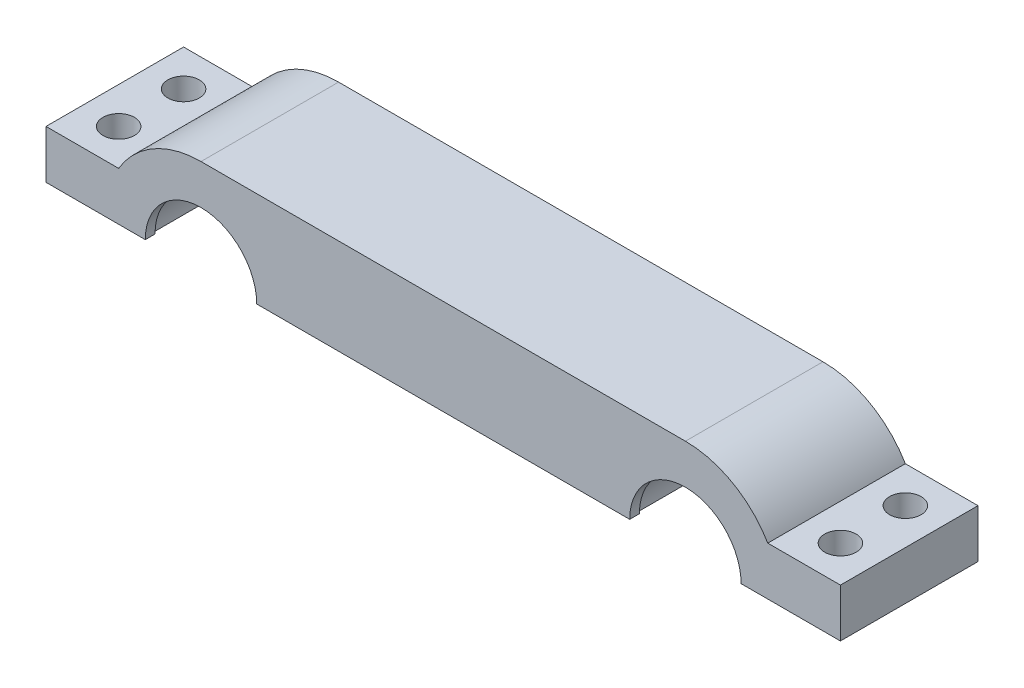
ISO-10303-21;
HEADER;
FILE_DESCRIPTION(('STEP AP214'),'2;1');
FILE_NAME('part.step','',(''),(''),'','','');
FILE_SCHEMA(('AUTOMOTIVE_DESIGN { 1 0 10303 214 1 1 1 1 }'));
ENDSEC;
DATA;
#1=APPLICATION_CONTEXT('core data for automotive mechanical design processes');
#2=APPLICATION_PROTOCOL_DEFINITION('international standard','automotive_design',2000,#1);
#3=PRODUCT_CONTEXT('',#1,'mechanical');
#4=PRODUCT('Part','Part','',(#3));
#5=PRODUCT_RELATED_PRODUCT_CATEGORY('part','',(#4));
#6=PRODUCT_DEFINITION_FORMATION('','',#4);
#7=PRODUCT_DEFINITION_CONTEXT('part definition',#1,'design');
#8=PRODUCT_DEFINITION('design','',#6,#7);
#9=PRODUCT_DEFINITION_SHAPE('','',#8);
#10=(LENGTH_UNIT() NAMED_UNIT(*) SI_UNIT(.MILLI.,.METRE.));
#11=(NAMED_UNIT(*) PLANE_ANGLE_UNIT() SI_UNIT($,.RADIAN.));
#12=(NAMED_UNIT(*) SI_UNIT($,.STERADIAN.) SOLID_ANGLE_UNIT());
#13=UNCERTAINTY_MEASURE_WITH_UNIT(LENGTH_MEASURE(1.E-05),#10,'distance_accuracy_value','');
#14=(GEOMETRIC_REPRESENTATION_CONTEXT(3) GLOBAL_UNCERTAINTY_ASSIGNED_CONTEXT((#13)) GLOBAL_UNIT_ASSIGNED_CONTEXT((#10,
#11,#12)) REPRESENTATION_CONTEXT('',''));
#15=CARTESIAN_POINT('',(0.,0.,0.));
#16=DIRECTION('',(0.,0.,1.));
#17=DIRECTION('',(1.,0.,0.));
#18=AXIS2_PLACEMENT_3D('',#15,#16,#17);
#19=CARTESIAN_POINT('',(-41.,0.,14.2));
#20=DIRECTION('',(0.,1.,0.));
#21=DIRECTION('',(0.,0.,1.));
#22=AXIS2_PLACEMENT_3D('',#19,#20,#21);
#23=PLANE('',#22);
#24=DIRECTION('',(-1.,0.,0.));
#25=VECTOR('',#24,1.);
#26=CARTESIAN_POINT('',(6.5,0.,4.5));
#27=LINE('',#26,#25);
#28=CARTESIAN_POINT('',(6.5,0.,4.5));
#29=VERTEX_POINT('',#28);
#30=CARTESIAN_POINT('',(2.625,0.,4.5));
#31=VERTEX_POINT('',#30);
#32=EDGE_CURVE('E251',#29,#31,#27,.T.);
#33=ORIENTED_EDGE('',*,*,#32,.T.);
#34=DIRECTION('',(0.,0.,-1.));
#35=VECTOR('',#34,1.);
#36=CARTESIAN_POINT('',(2.625,0.,10.3696784409369));
#37=LINE('',#36,#35);
#38=CARTESIAN_POINT('',(2.625,0.,0.));
#39=VERTEX_POINT('',#38);
#40=EDGE_CURVE('E56',#31,#39,#37,.T.);
#41=ORIENTED_EDGE('',*,*,#40,.T.);
#42=DIRECTION('',(1.,0.,0.));
#43=VECTOR('',#42,1.);
#44=CARTESIAN_POINT('',(-41.,0.,0.));
#45=LINE('',#44,#43);
#46=CARTESIAN_POINT('',(19.25,0.,0.));
#47=VERTEX_POINT('',#46);
#48=EDGE_CURVE('E368',#39,#47,#45,.T.);
#49=ORIENTED_EDGE('',*,*,#48,.T.);
#50=DIRECTION('',(0.,0.,-1.));
#51=VECTOR('',#50,1.);
#52=CARTESIAN_POINT('',(19.25,0.,1.));
#53=LINE('',#52,#51);
#54=CARTESIAN_POINT('',(19.25,0.,1.));
#55=VERTEX_POINT('',#54);
#56=EDGE_CURVE('E339',#55,#47,#53,.T.);
#57=ORIENTED_EDGE('',*,*,#56,.F.);
#58=DIRECTION('',(-1.,0.,0.));
#59=VECTOR('',#58,1.);
#60=CARTESIAN_POINT('',(19.25,0.,1.));
#61=LINE('',#60,#59);
#62=CARTESIAN_POINT('',(19.,0.,1.));
#63=VERTEX_POINT('',#62);
#64=EDGE_CURVE('E333',#55,#63,#61,.T.);
#65=ORIENTED_EDGE('',*,*,#64,.T.);
#66=DIRECTION('',(0.,0.,-1.));
#67=VECTOR('',#66,1.);
#68=CARTESIAN_POINT('',(19.,0.,27.6164078649987));
#69=LINE('',#68,#67);
#70=CARTESIAN_POINT('',(19.,0.,13.2));
#71=VERTEX_POINT('',#70);
#72=EDGE_CURVE('E345',#71,#63,#69,.T.);
#73=ORIENTED_EDGE('',*,*,#72,.F.);
#74=DIRECTION('',(-1.,0.,0.));
#75=VECTOR('',#74,1.);
#76=CARTESIAN_POINT('',(19.25,0.,13.2));
#77=LINE('',#76,#75);
#78=CARTESIAN_POINT('',(19.25,0.,13.2));
#79=VERTEX_POINT('',#78);
#80=EDGE_CURVE('E288',#79,#71,#77,.T.);
#81=ORIENTED_EDGE('',*,*,#80,.F.);
#82=DIRECTION('',(0.,0.,-1.));
#83=VECTOR('',#82,1.);
#84=CARTESIAN_POINT('',(19.25,0.,14.2));
#85=LINE('',#84,#83);
#86=CARTESIAN_POINT('',(19.25,0.,14.2));
#87=VERTEX_POINT('',#86);
#88=EDGE_CURVE('E299',#87,#79,#85,.T.);
#89=ORIENTED_EDGE('',*,*,#88,.F.);
#90=DIRECTION('',(1.,0.,0.));
#91=VECTOR('',#90,1.);
#92=CARTESIAN_POINT('',(-41.,0.,14.2));
#93=LINE('',#92,#91);
#94=CARTESIAN_POINT('',(-19.25,0.,14.2));
#95=VERTEX_POINT('',#94);
#96=EDGE_CURVE('E360',#95,#87,#93,.T.);
#97=ORIENTED_EDGE('',*,*,#96,.F.);
#98=DIRECTION('',(0.,0.,-1.));
#99=VECTOR('',#98,1.);
#100=CARTESIAN_POINT('',(-19.25,0.,14.2));
#101=LINE('',#100,#99);
#102=CARTESIAN_POINT('',(-19.25,0.,13.2));
#103=VERTEX_POINT('',#102);
#104=EDGE_CURVE('E268',#95,#103,#101,.T.);
#105=ORIENTED_EDGE('',*,*,#104,.T.);
#106=DIRECTION('',(-1.,0.,0.));
#107=VECTOR('',#106,1.);
#108=CARTESIAN_POINT('',(-19.,0.,13.2));
#109=LINE('',#108,#107);
#110=CARTESIAN_POINT('',(-19.,0.,13.2));
#111=VERTEX_POINT('',#110);
#112=EDGE_CURVE('E272',#111,#103,#109,.T.);
#113=ORIENTED_EDGE('',*,*,#112,.F.);
#114=DIRECTION('',(0.,0.,-1.));
#115=VECTOR('',#114,1.);
#116=CARTESIAN_POINT('',(-19.,0.,27.6164078649987));
#117=LINE('',#116,#115);
#118=CARTESIAN_POINT('',(-19.,0.,1.));
#119=VERTEX_POINT('',#118);
#120=EDGE_CURVE('E342',#111,#119,#117,.T.);
#121=ORIENTED_EDGE('',*,*,#120,.T.);
#122=DIRECTION('',(-1.,0.,0.));
#123=VECTOR('',#122,1.);
#124=CARTESIAN_POINT('',(-19.,0.,1.));
#125=LINE('',#124,#123);
#126=CARTESIAN_POINT('',(-19.25,0.,1.));
#127=VERTEX_POINT('',#126);
#128=EDGE_CURVE('E306',#119,#127,#125,.T.);
#129=ORIENTED_EDGE('',*,*,#128,.T.);
#130=DIRECTION('',(0.,0.,-1.));
#131=VECTOR('',#130,1.);
#132=CARTESIAN_POINT('',(-19.25,0.,1.));
#133=LINE('',#132,#131);
#134=CARTESIAN_POINT('',(-19.25,0.,0.));
#135=VERTEX_POINT('',#134);
#136=EDGE_CURVE('E315',#127,#135,#133,.T.);
#137=ORIENTED_EDGE('',*,*,#136,.T.);
#138=CARTESIAN_POINT('',(-2.625,0.,0.));
#139=VERTEX_POINT('',#138);
#140=EDGE_CURVE('E367',#135,#139,#45,.T.);
#141=ORIENTED_EDGE('',*,*,#140,.T.);
#142=DIRECTION('',(0.,0.,-1.));
#143=VECTOR('',#142,1.);
#144=CARTESIAN_POINT('',(-2.625,0.,10.3696784409369));
#145=LINE('',#144,#143);
#146=CARTESIAN_POINT('',(-2.625,0.,4.5));
#147=VERTEX_POINT('',#146);
#148=EDGE_CURVE('E243',#147,#139,#145,.T.);
#149=ORIENTED_EDGE('',*,*,#148,.F.);
#150=CARTESIAN_POINT('',(-6.5,0.,4.5));
#151=VERTEX_POINT('',#150);
#152=EDGE_CURVE('E256',#147,#151,#27,.T.);
#153=ORIENTED_EDGE('',*,*,#152,.T.);
#154=DIRECTION('',(0.,0.,-1.));
#155=VECTOR('',#154,1.);
#156=CARTESIAN_POINT('',(-6.5,0.,7.75));
#157=LINE('',#156,#155);
#158=CARTESIAN_POINT('',(-6.5,0.,7.75));
#159=VERTEX_POINT('',#158);
#160=EDGE_CURVE('E259',#159,#151,#157,.T.);
#161=ORIENTED_EDGE('',*,*,#160,.F.);
#162=DIRECTION('',(-1.,0.,0.));
#163=VECTOR('',#162,1.);
#164=CARTESIAN_POINT('',(6.5,0.,7.75));
#165=LINE('',#164,#163);
#166=CARTESIAN_POINT('',(6.5,0.,7.75));
#167=VERTEX_POINT('',#166);
#168=EDGE_CURVE('E250',#167,#159,#165,.T.);
#169=ORIENTED_EDGE('',*,*,#168,.F.);
#170=DIRECTION('',(0.,0.,-1.));
#171=VECTOR('',#170,1.);
#172=CARTESIAN_POINT('',(6.5,0.,7.75));
#173=LINE('',#172,#171);
#174=EDGE_CURVE('E254',#167,#29,#173,.T.);
#175=ORIENTED_EDGE('',*,*,#174,.T.);
#176=EDGE_LOOP('',(#33,#41,#49,#57,#65,#73,#81,#89,#97,#105,#113,#121,#129,#137,#141,#149,#153,
#161,#169,#175));
#177=FACE_BOUND('',#176,.T.);
#178=ADVANCED_FACE('F33',(#177),#23,.F.);
#179=CARTESIAN_POINT('',(-25.,0.,27.6164078649987));
#180=DIRECTION('',(0.,0.,-1.));
#181=DIRECTION('',(-1.,0.,0.));
#182=AXIS2_PLACEMENT_3D('',#179,#180,#181);
#183=CYLINDRICAL_SURFACE('',#182,6.);
#184=CARTESIAN_POINT('',(-25.,0.,13.2));
#185=DIRECTION('',(0.,0.,-1.));
#186=DIRECTION('',(1.,0.,0.));
#187=AXIS2_PLACEMENT_3D('',#184,#185,#186);
#188=CIRCLE('',#187,6.);
#189=CARTESIAN_POINT('',(-31.,0.,13.2));
#190=VERTEX_POINT('',#189);
#191=EDGE_CURVE('E262',#190,#111,#188,.T.);
#192=ORIENTED_EDGE('',*,*,#191,.F.);
#193=DIRECTION('',(0.,0.,-1.));
#194=VECTOR('',#193,1.);
#195=CARTESIAN_POINT('',(-31.,0.,27.6164078649987));
#196=LINE('',#195,#194);
#197=CARTESIAN_POINT('',(-31.,0.,1.));
#198=VERTEX_POINT('',#197);
#199=EDGE_CURVE('E350',#190,#198,#196,.T.);
#200=ORIENTED_EDGE('',*,*,#199,.T.);
#201=CARTESIAN_POINT('',(-25.,0.,1.));
#202=DIRECTION('',(0.,0.,-1.));
#203=DIRECTION('',(1.,0.,0.));
#204=AXIS2_PLACEMENT_3D('',#201,#202,#203);
#205=CIRCLE('',#204,6.);
#206=EDGE_CURVE('E303',#198,#119,#205,.T.);
#207=ORIENTED_EDGE('',*,*,#206,.T.);
#208=ORIENTED_EDGE('',*,*,#120,.F.);
#209=EDGE_LOOP('',(#192,#200,#207,#208));
#210=FACE_BOUND('',#209,.T.);
#211=ADVANCED_FACE('F413',(#210),#183,.F.);
#212=CARTESIAN_POINT('',(25.,0.,27.6164078649987));
#213=DIRECTION('',(0.,0.,-1.));
#214=DIRECTION('',(-1.,0.,0.));
#215=AXIS2_PLACEMENT_3D('',#212,#213,#214);
#216=CYLINDRICAL_SURFACE('',#215,6.);
#217=CARTESIAN_POINT('',(25.,0.,13.2));
#218=DIRECTION('',(0.,0.,-1.));
#219=DIRECTION('',(1.,0.,0.));
#220=AXIS2_PLACEMENT_3D('',#217,#218,#219);
#221=CIRCLE('',#220,6.);
#222=CARTESIAN_POINT('',(31.,0.,13.2));
#223=VERTEX_POINT('',#222);
#224=EDGE_CURVE('E282',#71,#223,#221,.T.);
#225=ORIENTED_EDGE('',*,*,#224,.F.);
#226=ORIENTED_EDGE('',*,*,#72,.T.);
#227=CARTESIAN_POINT('',(25.,0.,1.));
#228=DIRECTION('',(0.,0.,-1.));
#229=DIRECTION('',(1.,0.,0.));
#230=AXIS2_PLACEMENT_3D('',#227,#228,#229);
#231=CIRCLE('',#230,6.);
#232=CARTESIAN_POINT('',(31.,0.,1.));
#233=VERTEX_POINT('',#232);
#234=EDGE_CURVE('E324',#63,#233,#231,.T.);
#235=ORIENTED_EDGE('',*,*,#234,.T.);
#236=DIRECTION('',(0.,0.,-1.));
#237=VECTOR('',#236,1.);
#238=CARTESIAN_POINT('',(31.,0.,27.6164078649987));
#239=LINE('',#238,#237);
#240=EDGE_CURVE('E348',#223,#233,#239,.T.);
#241=ORIENTED_EDGE('',*,*,#240,.F.);
#242=EDGE_LOOP('',(#225,#226,#235,#241));
#243=FACE_BOUND('',#242,.T.);
#244=ADVANCED_FACE('F418',(#243),#216,.F.);
#245=CARTESIAN_POINT('',(37.25,0.,10.45));
#246=DIRECTION('',(0.,1.,0.));
#247=DIRECTION('',(0.,0.,1.));
#248=AXIS2_PLACEMENT_3D('',#245,#246,#247);
#249=CIRCLE('',#248,1.625);
#250=CARTESIAN_POINT('',(37.25,0.,12.075));
#251=VERTEX_POINT('',#250);
#252=EDGE_CURVE('E485',#251,#251,#249,.F.);
#253=ORIENTED_EDGE('',*,*,#252,.F.);
#254=EDGE_LOOP('',(#253));
#255=FACE_BOUND('',#254,.T.);
#256=CARTESIAN_POINT('',(37.25,0.,3.75));
#257=DIRECTION('',(0.,1.,0.));
#258=DIRECTION('',(0.,0.,1.));
#259=AXIS2_PLACEMENT_3D('',#256,#257,#258);
#260=CIRCLE('',#259,1.625);
#261=CARTESIAN_POINT('',(37.25,0.,5.375));
#262=VERTEX_POINT('',#261);
#263=EDGE_CURVE('E211',#262,#262,#260,.F.);
#264=ORIENTED_EDGE('',*,*,#263,.F.);
#265=EDGE_LOOP('',(#264));
#266=FACE_BOUND('',#265,.T.);
#267=CARTESIAN_POINT('',(30.75,0.,14.2));
#268=VERTEX_POINT('',#267);
#269=CARTESIAN_POINT('',(41.,0.,14.2));
#270=VERTEX_POINT('',#269);
#271=EDGE_CURVE('E355',#268,#270,#93,.T.);
#272=ORIENTED_EDGE('',*,*,#271,.F.);
#273=DIRECTION('',(0.,0.,-1.));
#274=VECTOR('',#273,1.);
#275=CARTESIAN_POINT('',(30.75,0.,14.2));
#276=LINE('',#275,#274);
#277=CARTESIAN_POINT('',(30.75,0.,13.2));
#278=VERTEX_POINT('',#277);
#279=EDGE_CURVE('E287',#268,#278,#276,.T.);
#280=ORIENTED_EDGE('',*,*,#279,.T.);
#281=DIRECTION('',(-1.,0.,0.));
#282=VECTOR('',#281,1.);
#283=CARTESIAN_POINT('',(30.75,0.,13.2));
#284=LINE('',#283,#282);
#285=EDGE_CURVE('E291',#223,#278,#284,.T.);
#286=ORIENTED_EDGE('',*,*,#285,.F.);
#287=ORIENTED_EDGE('',*,*,#240,.T.);
#288=DIRECTION('',(-1.,0.,0.));
#289=VECTOR('',#288,1.);
#290=CARTESIAN_POINT('',(30.75,0.,1.));
#291=LINE('',#290,#289);
#292=CARTESIAN_POINT('',(30.75,0.,1.));
#293=VERTEX_POINT('',#292);
#294=EDGE_CURVE('E327',#233,#293,#291,.T.);
#295=ORIENTED_EDGE('',*,*,#294,.T.);
#296=DIRECTION('',(0.,0.,-1.));
#297=VECTOR('',#296,1.);
#298=CARTESIAN_POINT('',(30.75,0.,1.));
#299=LINE('',#298,#297);
#300=CARTESIAN_POINT('',(30.75,0.,0.));
#301=VERTEX_POINT('',#300);
#302=EDGE_CURVE('E336',#293,#301,#299,.T.);
#303=ORIENTED_EDGE('',*,*,#302,.T.);
#304=CARTESIAN_POINT('',(41.,0.,0.));
#305=VERTEX_POINT('',#304);
#306=EDGE_CURVE('E364',#301,#305,#45,.T.);
#307=ORIENTED_EDGE('',*,*,#306,.T.);
#308=DIRECTION('',(0.,0.,-1.));
#309=VECTOR('',#308,1.);
#310=CARTESIAN_POINT('',(41.,0.,14.2));
#311=LINE('',#310,#309);
#312=EDGE_CURVE('E41',#270,#305,#311,.T.);
#313=ORIENTED_EDGE('',*,*,#312,.F.);
#314=EDGE_LOOP('',(#272,#280,#286,#287,#295,#303,#307,#313));
#315=FACE_BOUND('',#314,.T.);
#316=ADVANCED_FACE('F377',(#255,#266,#315),#23,.F.);
#317=CARTESIAN_POINT('',(-41.,0.,14.2));
#318=DIRECTION('',(1.,0.,0.));
#319=DIRECTION('',(0.,0.,-1.));
#320=AXIS2_PLACEMENT_3D('',#317,#318,#319);
#321=PLANE('',#320);
#322=DIRECTION('',(0.,-1.,0.));
#323=VECTOR('',#322,1.);
#324=CARTESIAN_POINT('',(-41.,0.,14.2));
#325=LINE('',#324,#323);
#326=CARTESIAN_POINT('',(-41.,5.,14.2));
#327=VERTEX_POINT('',#326);
#328=CARTESIAN_POINT('',(-41.,0.,14.2));
#329=VERTEX_POINT('',#328);
#330=EDGE_CURVE('E353',#327,#329,#325,.T.);
#331=ORIENTED_EDGE('',*,*,#330,.F.);
#332=DIRECTION('',(0.,0.,-1.));
#333=VECTOR('',#332,1.);
#334=CARTESIAN_POINT('',(-41.,5.,98.6037913840368));
#335=LINE('',#334,#333);
#336=CARTESIAN_POINT('',(-41.,5.,0.));
#337=VERTEX_POINT('',#336);
#338=EDGE_CURVE('E227',#327,#337,#335,.T.);
#339=ORIENTED_EDGE('',*,*,#338,.T.);
#340=DIRECTION('',(0.,-1.,0.));
#341=VECTOR('',#340,1.);
#342=CARTESIAN_POINT('',(-41.,0.,0.));
#343=LINE('',#342,#341);
#344=CARTESIAN_POINT('',(-41.,0.,0.));
#345=VERTEX_POINT('',#344);
#346=EDGE_CURVE('E347',#337,#345,#343,.T.);
#347=ORIENTED_EDGE('',*,*,#346,.T.);
#348=DIRECTION('',(0.,0.,-1.));
#349=VECTOR('',#348,1.);
#350=CARTESIAN_POINT('',(-41.,0.,14.2));
#351=LINE('',#350,#349);
#352=EDGE_CURVE('E11',#329,#345,#351,.T.);
#353=ORIENTED_EDGE('',*,*,#352,.F.);
#354=EDGE_LOOP('',(#331,#339,#347,#353));
#355=FACE_BOUND('',#354,.T.);
#356=ADVANCED_FACE('F35',(#355),#321,.F.);
#357=CARTESIAN_POINT('',(-37.25,0.,3.75));
#358=DIRECTION('',(0.,1.,0.));
#359=DIRECTION('',(0.,0.,1.));
#360=AXIS2_PLACEMENT_3D('',#357,#358,#359);
#361=CIRCLE('',#360,1.625);
#362=CARTESIAN_POINT('',(-37.25,0.,5.375));
#363=VERTEX_POINT('',#362);
#364=EDGE_CURVE('E435',#363,#363,#361,.F.);
#365=ORIENTED_EDGE('',*,*,#364,.F.);
#366=EDGE_LOOP('',(#365));
#367=FACE_BOUND('',#366,.T.);
#368=CARTESIAN_POINT('',(-37.25,0.,10.45));
#369=DIRECTION('',(0.,1.,0.));
#370=DIRECTION('',(0.,0.,1.));
#371=AXIS2_PLACEMENT_3D('',#368,#369,#370);
#372=CIRCLE('',#371,1.625);
#373=CARTESIAN_POINT('',(-37.25,0.,12.075));
#374=VERTEX_POINT('',#373);
#375=EDGE_CURVE('E439',#374,#374,#372,.F.);
#376=ORIENTED_EDGE('',*,*,#375,.F.);
#377=EDGE_LOOP('',(#376));
#378=FACE_BOUND('',#377,.T.);
#379=CARTESIAN_POINT('',(-30.75,0.,0.));
#380=VERTEX_POINT('',#379);
#381=EDGE_CURVE('E365',#345,#380,#45,.T.);
#382=ORIENTED_EDGE('',*,*,#381,.T.);
#383=DIRECTION('',(0.,0.,-1.));
#384=VECTOR('',#383,1.);
#385=CARTESIAN_POINT('',(-30.75,0.,1.));
#386=LINE('',#385,#384);
#387=CARTESIAN_POINT('',(-30.75,0.,1.));
#388=VERTEX_POINT('',#387);
#389=EDGE_CURVE('E318',#388,#380,#386,.T.);
#390=ORIENTED_EDGE('',*,*,#389,.F.);
#391=DIRECTION('',(-1.,0.,0.));
#392=VECTOR('',#391,1.);
#393=CARTESIAN_POINT('',(-31.,0.,1.));
#394=LINE('',#393,#392);
#395=EDGE_CURVE('E312',#388,#198,#394,.T.);
#396=ORIENTED_EDGE('',*,*,#395,.T.);
#397=ORIENTED_EDGE('',*,*,#199,.F.);
#398=DIRECTION('',(-1.,0.,0.));
#399=VECTOR('',#398,1.);
#400=CARTESIAN_POINT('',(-31.,0.,13.2));
#401=LINE('',#400,#399);
#402=CARTESIAN_POINT('',(-30.75,0.,13.2));
#403=VERTEX_POINT('',#402);
#404=EDGE_CURVE('E269',#403,#190,#401,.T.);
#405=ORIENTED_EDGE('',*,*,#404,.F.);
#406=DIRECTION('',(0.,0.,-1.));
#407=VECTOR('',#406,1.);
#408=CARTESIAN_POINT('',(-30.75,0.,14.2));
#409=LINE('',#408,#407);
#410=CARTESIAN_POINT('',(-30.75,0.,14.2));
#411=VERTEX_POINT('',#410);
#412=EDGE_CURVE('E280',#411,#403,#409,.T.);
#413=ORIENTED_EDGE('',*,*,#412,.F.);
#414=EDGE_CURVE('E357',#329,#411,#93,.T.);
#415=ORIENTED_EDGE('',*,*,#414,.F.);
#416=ORIENTED_EDGE('',*,*,#352,.T.);
#417=EDGE_LOOP('',(#382,#390,#396,#397,#405,#413,#415,#416));
#418=FACE_BOUND('',#417,.T.);
#419=ADVANCED_FACE('F414',(#367,#378,#418),#23,.F.);
#420=CARTESIAN_POINT('',(41.,0.,14.2));
#421=DIRECTION('',(-1.,0.,0.));
#422=DIRECTION('',(0.,0.,1.));
#423=AXIS2_PLACEMENT_3D('',#420,#421,#422);
#424=PLANE('',#423);
#425=DIRECTION('',(0.,1.,0.));
#426=VECTOR('',#425,1.);
#427=CARTESIAN_POINT('',(41.,0.,0.));
#428=LINE('',#427,#426);
#429=CARTESIAN_POINT('',(41.,5.,0.));
#430=VERTEX_POINT('',#429);
#431=EDGE_CURVE('E356',#305,#430,#428,.T.);
#432=ORIENTED_EDGE('',*,*,#431,.T.);
#433=DIRECTION('',(0.,0.,-1.));
#434=VECTOR('',#433,1.);
#435=CARTESIAN_POINT('',(41.,5.,98.6037913840368));
#436=LINE('',#435,#434);
#437=CARTESIAN_POINT('',(41.,5.,14.2));
#438=VERTEX_POINT('',#437);
#439=EDGE_CURVE('E48',#438,#430,#436,.T.);
#440=ORIENTED_EDGE('',*,*,#439,.F.);
#441=DIRECTION('',(0.,1.,0.));
#442=VECTOR('',#441,1.);
#443=CARTESIAN_POINT('',(41.,0.,14.2));
#444=LINE('',#443,#442);
#445=EDGE_CURVE('E359',#270,#438,#444,.T.);
#446=ORIENTED_EDGE('',*,*,#445,.F.);
#447=ORIENTED_EDGE('',*,*,#312,.T.);
#448=EDGE_LOOP('',(#432,#440,#446,#447));
#449=FACE_BOUND('',#448,.T.);
#450=ADVANCED_FACE('F373',(#449),#424,.F.);
#451=CARTESIAN_POINT('',(0.,0.,14.2));
#452=DIRECTION('',(0.,0.,-1.));
#453=DIRECTION('',(-1.,0.,0.));
#454=AXIS2_PLACEMENT_3D('',#451,#452,#453);
#455=PLANE('',#454);
#456=CARTESIAN_POINT('',(-25.,0.,14.2));
#457=DIRECTION('',(0.,0.,-1.));
#458=DIRECTION('',(-1.,0.,0.));
#459=AXIS2_PLACEMENT_3D('',#456,#457,#458);
#460=CIRCLE('',#459,9.86154146165801);
#461=CARTESIAN_POINT('',(-33.5,5.,14.2));
#462=VERTEX_POINT('',#461);
#463=CARTESIAN_POINT('',(-25.,9.86154146165801,14.2));
#464=VERTEX_POINT('',#463);
#465=EDGE_CURVE('E471',#462,#464,#460,.T.);
#466=ORIENTED_EDGE('',*,*,#465,.F.);
#467=DIRECTION('',(1.,0.,0.));
#468=VECTOR('',#467,1.);
#469=CARTESIAN_POINT('',(-33.5,5.,14.2));
#470=LINE('',#469,#468);
#471=EDGE_CURVE('E239',#327,#462,#470,.T.);
#472=ORIENTED_EDGE('',*,*,#471,.F.);
#473=ORIENTED_EDGE('',*,*,#330,.T.);
#474=ORIENTED_EDGE('',*,*,#414,.T.);
#475=CARTESIAN_POINT('',(-25.,0.,14.2));
#476=DIRECTION('',(0.,0.,1.));
#477=DIRECTION('',(1.,0.,0.));
#478=AXIS2_PLACEMENT_3D('',#475,#476,#477);
#479=CIRCLE('',#478,5.75);
#480=EDGE_CURVE('E265',#95,#411,#479,.T.);
#481=ORIENTED_EDGE('',*,*,#480,.F.);
#482=ORIENTED_EDGE('',*,*,#96,.T.);
#483=CARTESIAN_POINT('',(25.,0.,14.2));
#484=DIRECTION('',(0.,0.,1.));
#485=DIRECTION('',(1.,0.,0.));
#486=AXIS2_PLACEMENT_3D('',#483,#484,#485);
#487=CIRCLE('',#486,5.75);
#488=EDGE_CURVE('E284',#268,#87,#487,.T.);
#489=ORIENTED_EDGE('',*,*,#488,.F.);
#490=ORIENTED_EDGE('',*,*,#271,.T.);
#491=ORIENTED_EDGE('',*,*,#445,.T.);
#492=DIRECTION('',(1.,0.,0.));
#493=VECTOR('',#492,1.);
#494=CARTESIAN_POINT('',(41.,5.,14.2));
#495=LINE('',#494,#493);
#496=CARTESIAN_POINT('',(33.5,5.,14.2));
#497=VERTEX_POINT('',#496);
#498=EDGE_CURVE('E236',#497,#438,#495,.T.);
#499=ORIENTED_EDGE('',*,*,#498,.F.);
#500=CARTESIAN_POINT('',(25.,0.,14.2));
#501=DIRECTION('',(0.,0.,-1.));
#502=DIRECTION('',(-1.,0.,0.));
#503=AXIS2_PLACEMENT_3D('',#500,#501,#502);
#504=CIRCLE('',#503,9.86154146165801);
#505=CARTESIAN_POINT('',(25.,9.86154146165801,14.2));
#506=VERTEX_POINT('',#505);
#507=EDGE_CURVE('E202',#506,#497,#504,.T.);
#508=ORIENTED_EDGE('',*,*,#507,.F.);
#509=DIRECTION('',(1.,0.,0.));
#510=VECTOR('',#509,1.);
#511=CARTESIAN_POINT('',(25.,9.86154146165801,14.2));
#512=LINE('',#511,#510);
#513=EDGE_CURVE('E475',#464,#506,#512,.T.);
#514=ORIENTED_EDGE('',*,*,#513,.F.);
#515=EDGE_LOOP('',(#466,#472,#473,#474,#481,#482,#489,#490,#491,#499,#508,#514));
#516=FACE_BOUND('',#515,.T.);
#517=ADVANCED_FACE('F430',(#516),#455,.F.);
#518=CARTESIAN_POINT('',(0.,0.,0.));
#519=DIRECTION('',(0.,0.,-1.));
#520=DIRECTION('',(-1.,0.,0.));
#521=AXIS2_PLACEMENT_3D('',#518,#519,#520);
#522=PLANE('',#521);
#523=DIRECTION('',(-1.,0.,0.));
#524=VECTOR('',#523,1.);
#525=CARTESIAN_POINT('',(-33.5,5.,0.));
#526=LINE('',#525,#524);
#527=CARTESIAN_POINT('',(-33.5,5.,0.));
#528=VERTEX_POINT('',#527);
#529=EDGE_CURVE('E225',#528,#337,#526,.T.);
#530=ORIENTED_EDGE('',*,*,#529,.F.);
#531=CARTESIAN_POINT('',(-25.,0.,0.));
#532=DIRECTION('',(0.,0.,1.));
#533=DIRECTION('',(1.,0.,0.));
#534=AXIS2_PLACEMENT_3D('',#531,#532,#533);
#535=CIRCLE('',#534,9.86154146165801);
#536=CARTESIAN_POINT('',(-25.,9.86154146165801,0.));
#537=VERTEX_POINT('',#536);
#538=EDGE_CURVE('E219',#537,#528,#535,.T.);
#539=ORIENTED_EDGE('',*,*,#538,.F.);
#540=DIRECTION('',(-1.,0.,0.));
#541=VECTOR('',#540,1.);
#542=CARTESIAN_POINT('',(25.,9.86154146165801,0.));
#543=LINE('',#542,#541);
#544=CARTESIAN_POINT('',(25.,9.86154146165801,0.));
#545=VERTEX_POINT('',#544);
#546=EDGE_CURVE('E217',#545,#537,#543,.T.);
#547=ORIENTED_EDGE('',*,*,#546,.F.);
#548=CARTESIAN_POINT('',(25.,0.,0.));
#549=DIRECTION('',(0.,0.,1.));
#550=DIRECTION('',(1.,0.,0.));
#551=AXIS2_PLACEMENT_3D('',#548,#549,#550);
#552=CIRCLE('',#551,9.86154146165801);
#553=CARTESIAN_POINT('',(33.5,5.,0.));
#554=VERTEX_POINT('',#553);
#555=EDGE_CURVE('E199',#554,#545,#552,.T.);
#556=ORIENTED_EDGE('',*,*,#555,.F.);
#557=DIRECTION('',(-1.,0.,0.));
#558=VECTOR('',#557,1.);
#559=CARTESIAN_POINT('',(41.,5.,0.));
#560=LINE('',#559,#558);
#561=EDGE_CURVE('E206',#430,#554,#560,.T.);
#562=ORIENTED_EDGE('',*,*,#561,.F.);
#563=ORIENTED_EDGE('',*,*,#431,.F.);
#564=ORIENTED_EDGE('',*,*,#306,.F.);
#565=CARTESIAN_POINT('',(25.,0.,0.));
#566=DIRECTION('',(0.,0.,1.));
#567=DIRECTION('',(1.,0.,0.));
#568=AXIS2_PLACEMENT_3D('',#565,#566,#567);
#569=CIRCLE('',#568,5.75);
#570=EDGE_CURVE('E321',#301,#47,#569,.T.);
#571=ORIENTED_EDGE('',*,*,#570,.T.);
#572=ORIENTED_EDGE('',*,*,#48,.F.);
#573=CARTESIAN_POINT('',(0.,0.,0.));
#574=DIRECTION('',(0.,0.,-1.));
#575=DIRECTION('',(-1.,0.,0.));
#576=AXIS2_PLACEMENT_3D('',#573,#574,#575);
#577=CIRCLE('',#576,2.625);
#578=EDGE_CURVE('E238',#139,#39,#577,.T.);
#579=ORIENTED_EDGE('',*,*,#578,.F.);
#580=ORIENTED_EDGE('',*,*,#140,.F.);
#581=CARTESIAN_POINT('',(-25.,0.,0.));
#582=DIRECTION('',(0.,0.,1.));
#583=DIRECTION('',(1.,0.,0.));
#584=AXIS2_PLACEMENT_3D('',#581,#582,#583);
#585=CIRCLE('',#584,5.75);
#586=EDGE_CURVE('E301',#135,#380,#585,.T.);
#587=ORIENTED_EDGE('',*,*,#586,.T.);
#588=ORIENTED_EDGE('',*,*,#381,.F.);
#589=ORIENTED_EDGE('',*,*,#346,.F.);
#590=EDGE_LOOP('',(#530,#539,#547,#556,#562,#563,#564,#571,#572,#579,#580,#587,#588,#589));
#591=FACE_BOUND('',#590,.T.);
#592=ADVANCED_FACE('F214',(#591),#522,.T.);
#593=CARTESIAN_POINT('',(25.,0.,1.));
#594=DIRECTION('',(0.,0.,-1.));
#595=DIRECTION('',(-1.,0.,0.));
#596=AXIS2_PLACEMENT_3D('',#593,#594,#595);
#597=CYLINDRICAL_SURFACE('',#596,5.75);
#598=ORIENTED_EDGE('',*,*,#570,.F.);
#599=ORIENTED_EDGE('',*,*,#302,.F.);
#600=CARTESIAN_POINT('',(25.,0.,1.));
#601=DIRECTION('',(0.,0.,1.));
#602=DIRECTION('',(1.,0.,0.));
#603=AXIS2_PLACEMENT_3D('',#600,#601,#602);
#604=CIRCLE('',#603,5.75);
#605=EDGE_CURVE('E330',#293,#55,#604,.T.);
#606=ORIENTED_EDGE('',*,*,#605,.T.);
#607=ORIENTED_EDGE('',*,*,#56,.T.);
#608=EDGE_LOOP('',(#598,#599,#606,#607));
#609=FACE_BOUND('',#608,.T.);
#610=ADVANCED_FACE('F381',(#609),#597,.F.);
#611=CARTESIAN_POINT('',(25.,0.,1.));
#612=DIRECTION('',(0.,0.,1.));
#613=DIRECTION('',(1.,0.,0.));
#614=AXIS2_PLACEMENT_3D('',#611,#612,#613);
#615=PLANE('',#614);
#616=ORIENTED_EDGE('',*,*,#234,.F.);
#617=ORIENTED_EDGE('',*,*,#64,.F.);
#618=ORIENTED_EDGE('',*,*,#605,.F.);
#619=ORIENTED_EDGE('',*,*,#294,.F.);
#620=EDGE_LOOP('',(#616,#617,#618,#619));
#621=FACE_BOUND('',#620,.T.);
#622=ADVANCED_FACE('F727',(#621),#615,.T.);
#623=CARTESIAN_POINT('',(-25.,0.,1.));
#624=DIRECTION('',(0.,0.,-1.));
#625=DIRECTION('',(-1.,0.,0.));
#626=AXIS2_PLACEMENT_3D('',#623,#624,#625);
#627=CYLINDRICAL_SURFACE('',#626,5.75);
#628=ORIENTED_EDGE('',*,*,#586,.F.);
#629=ORIENTED_EDGE('',*,*,#136,.F.);
#630=CARTESIAN_POINT('',(-25.,0.,1.));
#631=DIRECTION('',(0.,0.,1.));
#632=DIRECTION('',(1.,0.,0.));
#633=AXIS2_PLACEMENT_3D('',#630,#631,#632);
#634=CIRCLE('',#633,5.75);
#635=EDGE_CURVE('E309',#127,#388,#634,.T.);
#636=ORIENTED_EDGE('',*,*,#635,.T.);
#637=ORIENTED_EDGE('',*,*,#389,.T.);
#638=EDGE_LOOP('',(#628,#629,#636,#637));
#639=FACE_BOUND('',#638,.T.);
#640=ADVANCED_FACE('F444',(#639),#627,.F.);
#641=CARTESIAN_POINT('',(-25.,0.,1.));
#642=DIRECTION('',(0.,0.,1.));
#643=DIRECTION('',(1.,0.,0.));
#644=AXIS2_PLACEMENT_3D('',#641,#642,#643);
#645=PLANE('',#644);
#646=ORIENTED_EDGE('',*,*,#206,.F.);
#647=ORIENTED_EDGE('',*,*,#395,.F.);
#648=ORIENTED_EDGE('',*,*,#635,.F.);
#649=ORIENTED_EDGE('',*,*,#128,.F.);
#650=EDGE_LOOP('',(#646,#647,#648,#649));
#651=FACE_BOUND('',#650,.T.);
#652=ADVANCED_FACE('F450',(#651),#645,.T.);
#653=CARTESIAN_POINT('',(25.,0.,14.2));
#654=DIRECTION('',(0.,0.,-1.));
#655=DIRECTION('',(-1.,0.,0.));
#656=AXIS2_PLACEMENT_3D('',#653,#654,#655);
#657=CYLINDRICAL_SURFACE('',#656,5.75);
#658=CARTESIAN_POINT('',(25.,0.,13.2));
#659=DIRECTION('',(0.,0.,1.));
#660=DIRECTION('',(1.,0.,0.));
#661=AXIS2_PLACEMENT_3D('',#658,#659,#660);
#662=CIRCLE('',#661,5.75);
#663=EDGE_CURVE('E294',#278,#79,#662,.T.);
#664=ORIENTED_EDGE('',*,*,#663,.F.);
#665=ORIENTED_EDGE('',*,*,#279,.F.);
#666=ORIENTED_EDGE('',*,*,#488,.T.);
#667=ORIENTED_EDGE('',*,*,#88,.T.);
#668=EDGE_LOOP('',(#664,#665,#666,#667));
#669=FACE_BOUND('',#668,.T.);
#670=ADVANCED_FACE('F688',(#669),#657,.F.);
#671=CARTESIAN_POINT('',(25.,0.,13.2));
#672=DIRECTION('',(0.,0.,1.));
#673=DIRECTION('',(1.,0.,0.));
#674=AXIS2_PLACEMENT_3D('',#671,#672,#673);
#675=PLANE('',#674);
#676=ORIENTED_EDGE('',*,*,#224,.T.);
#677=ORIENTED_EDGE('',*,*,#285,.T.);
#678=ORIENTED_EDGE('',*,*,#663,.T.);
#679=ORIENTED_EDGE('',*,*,#80,.T.);
#680=EDGE_LOOP('',(#676,#677,#678,#679));
#681=FACE_BOUND('',#680,.T.);
#682=ADVANCED_FACE('F679',(#681),#675,.F.);
#683=CARTESIAN_POINT('',(-25.,0.,14.2));
#684=DIRECTION('',(0.,0.,-1.));
#685=DIRECTION('',(-1.,0.,0.));
#686=AXIS2_PLACEMENT_3D('',#683,#684,#685);
#687=CYLINDRICAL_SURFACE('',#686,5.75);
#688=CARTESIAN_POINT('',(-25.,0.,13.2));
#689=DIRECTION('',(0.,0.,1.));
#690=DIRECTION('',(1.,0.,0.));
#691=AXIS2_PLACEMENT_3D('',#688,#689,#690);
#692=CIRCLE('',#691,5.75);
#693=EDGE_CURVE('E275',#103,#403,#692,.T.);
#694=ORIENTED_EDGE('',*,*,#693,.F.);
#695=ORIENTED_EDGE('',*,*,#104,.F.);
#696=ORIENTED_EDGE('',*,*,#480,.T.);
#697=ORIENTED_EDGE('',*,*,#412,.T.);
#698=EDGE_LOOP('',(#694,#695,#696,#697));
#699=FACE_BOUND('',#698,.T.);
#700=ADVANCED_FACE('F459',(#699),#687,.F.);
#701=CARTESIAN_POINT('',(-25.,0.,13.2));
#702=DIRECTION('',(0.,0.,1.));
#703=DIRECTION('',(1.,0.,0.));
#704=AXIS2_PLACEMENT_3D('',#701,#702,#703);
#705=PLANE('',#704);
#706=ORIENTED_EDGE('',*,*,#191,.T.);
#707=ORIENTED_EDGE('',*,*,#112,.T.);
#708=ORIENTED_EDGE('',*,*,#693,.T.);
#709=ORIENTED_EDGE('',*,*,#404,.T.);
#710=EDGE_LOOP('',(#706,#707,#708,#709));
#711=FACE_BOUND('',#710,.T.);
#712=ADVANCED_FACE('F409',(#711),#705,.F.);
#713=CARTESIAN_POINT('',(0.,0.,7.75));
#714=DIRECTION('',(0.,0.,-1.));
#715=DIRECTION('',(-1.,0.,0.));
#716=AXIS2_PLACEMENT_3D('',#713,#714,#715);
#717=CYLINDRICAL_SURFACE('',#716,6.5);
#718=CARTESIAN_POINT('',(0.,0.,4.5));
#719=DIRECTION('',(0.,0.,-1.));
#720=DIRECTION('',(-1.,0.,0.));
#721=AXIS2_PLACEMENT_3D('',#718,#719,#720);
#722=CIRCLE('',#721,6.5);
#723=EDGE_CURVE('E242',#151,#29,#722,.T.);
#724=ORIENTED_EDGE('',*,*,#723,.T.);
#725=ORIENTED_EDGE('',*,*,#174,.F.);
#726=CARTESIAN_POINT('',(0.,0.,7.75));
#727=DIRECTION('',(0.,0.,-1.));
#728=DIRECTION('',(-1.,0.,0.));
#729=AXIS2_PLACEMENT_3D('',#726,#727,#728);
#730=CIRCLE('',#729,6.5);
#731=EDGE_CURVE('E247',#159,#167,#730,.T.);
#732=ORIENTED_EDGE('',*,*,#731,.F.);
#733=ORIENTED_EDGE('',*,*,#160,.T.);
#734=EDGE_LOOP('',(#724,#725,#732,#733));
#735=FACE_BOUND('',#734,.T.);
#736=ADVANCED_FACE('F399',(#735),#717,.F.);
#737=CARTESIAN_POINT('',(0.,0.,7.75));
#738=DIRECTION('',(0.,0.,-1.));
#739=DIRECTION('',(-1.,0.,0.));
#740=AXIS2_PLACEMENT_3D('',#737,#738,#739);
#741=PLANE('',#740);
#742=ORIENTED_EDGE('',*,*,#731,.T.);
#743=ORIENTED_EDGE('',*,*,#168,.T.);
#744=EDGE_LOOP('',(#742,#743));
#745=FACE_BOUND('',#744,.T.);
#746=ADVANCED_FACE('F401',(#745),#741,.T.);
#747=CARTESIAN_POINT('',(0.,0.,4.5));
#748=DIRECTION('',(0.,0.,-1.));
#749=DIRECTION('',(-1.,0.,0.));
#750=AXIS2_PLACEMENT_3D('',#747,#748,#749);
#751=PLANE('',#750);
#752=ORIENTED_EDGE('',*,*,#152,.F.);
#753=CARTESIAN_POINT('',(0.,0.,4.5));
#754=DIRECTION('',(0.,0.,-1.));
#755=DIRECTION('',(-1.,0.,0.));
#756=AXIS2_PLACEMENT_3D('',#753,#754,#755);
#757=CIRCLE('',#756,2.625);
#758=EDGE_CURVE('E240',#31,#147,#757,.F.);
#759=ORIENTED_EDGE('',*,*,#758,.F.);
#760=ORIENTED_EDGE('',*,*,#32,.F.);
#761=ORIENTED_EDGE('',*,*,#723,.F.);
#762=EDGE_LOOP('',(#752,#759,#760,#761));
#763=FACE_BOUND('',#762,.T.);
#764=ADVANCED_FACE('F394',(#763),#751,.F.);
#765=CARTESIAN_POINT('',(0.,0.,10.3696784409369));
#766=DIRECTION('',(0.,0.,-1.));
#767=DIRECTION('',(-1.,0.,0.));
#768=AXIS2_PLACEMENT_3D('',#765,#766,#767);
#769=CYLINDRICAL_SURFACE('',#768,2.625);
#770=ORIENTED_EDGE('',*,*,#758,.T.);
#771=ORIENTED_EDGE('',*,*,#148,.T.);
#772=ORIENTED_EDGE('',*,*,#578,.T.);
#773=ORIENTED_EDGE('',*,*,#40,.F.);
#774=EDGE_LOOP('',(#770,#771,#772,#773));
#775=FACE_BOUND('',#774,.T.);
#776=ADVANCED_FACE('F391',(#775),#769,.F.);
#777=CARTESIAN_POINT('',(-33.5,5.,98.6037913840368));
#778=DIRECTION('',(0.,-1.,0.));
#779=DIRECTION('',(1.,0.,0.));
#780=AXIS2_PLACEMENT_3D('',#777,#778,#779);
#781=PLANE('',#780);
#782=CARTESIAN_POINT('',(-37.25,5.,3.75));
#783=DIRECTION('',(0.,1.,0.));
#784=DIRECTION('',(0.,0.,-1.));
#785=AXIS2_PLACEMENT_3D('',#782,#783,#784);
#786=CIRCLE('',#785,1.625);
#787=CARTESIAN_POINT('',(-37.25,5.,2.125));
#788=VERTEX_POINT('',#787);
#789=EDGE_CURVE('E488',#788,#788,#786,.T.);
#790=ORIENTED_EDGE('',*,*,#789,.F.);
#791=EDGE_LOOP('',(#790));
#792=FACE_BOUND('',#791,.T.);
#793=CARTESIAN_POINT('',(-37.25,5.,10.45));
#794=DIRECTION('',(0.,1.,0.));
#795=DIRECTION('',(0.,0.,-1.));
#796=AXIS2_PLACEMENT_3D('',#793,#794,#795);
#797=CIRCLE('',#796,1.625);
#798=CARTESIAN_POINT('',(-37.25,5.,8.825));
#799=VERTEX_POINT('',#798);
#800=EDGE_CURVE('E496',#799,#799,#797,.T.);
#801=ORIENTED_EDGE('',*,*,#800,.F.);
#802=EDGE_LOOP('',(#801));
#803=FACE_BOUND('',#802,.T.);
#804=ORIENTED_EDGE('',*,*,#471,.T.);
#805=DIRECTION('',(0.,0.,-1.));
#806=VECTOR('',#805,1.);
#807=CARTESIAN_POINT('',(-33.5,5.,98.6037913840368));
#808=LINE('',#807,#806);
#809=EDGE_CURVE('E230',#462,#528,#808,.T.);
#810=ORIENTED_EDGE('',*,*,#809,.T.);
#811=ORIENTED_EDGE('',*,*,#529,.T.);
#812=ORIENTED_EDGE('',*,*,#338,.F.);
#813=EDGE_LOOP('',(#804,#810,#811,#812));
#814=FACE_BOUND('',#813,.T.);
#815=ADVANCED_FACE('F464',(#792,#803,#814),#781,.F.);
#816=CARTESIAN_POINT('',(-25.,0.,98.6037913840368));
#817=DIRECTION('',(0.,0.,-1.));
#818=DIRECTION('',(-1.,0.,0.));
#819=AXIS2_PLACEMENT_3D('',#816,#817,#818);
#820=CYLINDRICAL_SURFACE('',#819,9.86154146165801);
#821=ORIENTED_EDGE('',*,*,#465,.T.);
#822=DIRECTION('',(0.,0.,-1.));
#823=VECTOR('',#822,1.);
#824=CARTESIAN_POINT('',(-25.,9.86154146165801,98.6037913840368));
#825=LINE('',#824,#823);
#826=EDGE_CURVE('E232',#464,#537,#825,.T.);
#827=ORIENTED_EDGE('',*,*,#826,.T.);
#828=ORIENTED_EDGE('',*,*,#538,.T.);
#829=ORIENTED_EDGE('',*,*,#809,.F.);
#830=EDGE_LOOP('',(#821,#827,#828,#829));
#831=FACE_BOUND('',#830,.T.);
#832=ADVANCED_FACE('F469',(#831),#820,.T.);
#833=CARTESIAN_POINT('',(25.,9.86154146165801,98.6037913840368));
#834=DIRECTION('',(0.,-1.,0.));
#835=DIRECTION('',(0.,0.,-1.));
#836=AXIS2_PLACEMENT_3D('',#833,#834,#835);
#837=PLANE('',#836);
#838=ORIENTED_EDGE('',*,*,#513,.T.);
#839=DIRECTION('',(0.,0.,-1.));
#840=VECTOR('',#839,1.);
#841=CARTESIAN_POINT('',(25.,9.86154146165801,98.6037913840368));
#842=LINE('',#841,#840);
#843=EDGE_CURVE('E204',#506,#545,#842,.T.);
#844=ORIENTED_EDGE('',*,*,#843,.T.);
#845=ORIENTED_EDGE('',*,*,#546,.T.);
#846=ORIENTED_EDGE('',*,*,#826,.F.);
#847=EDGE_LOOP('',(#838,#844,#845,#846));
#848=FACE_BOUND('',#847,.T.);
#849=ADVANCED_FACE('F474',(#848),#837,.F.);
#850=CARTESIAN_POINT('',(25.,0.,98.6037913840368));
#851=DIRECTION('',(0.,0.,-1.));
#852=DIRECTION('',(-1.,0.,0.));
#853=AXIS2_PLACEMENT_3D('',#850,#851,#852);
#854=CYLINDRICAL_SURFACE('',#853,9.86154146165801);
#855=ORIENTED_EDGE('',*,*,#507,.T.);
#856=DIRECTION('',(0.,0.,-1.));
#857=VECTOR('',#856,1.);
#858=CARTESIAN_POINT('',(33.5,5.,98.6037913840368));
#859=LINE('',#858,#857);
#860=EDGE_CURVE('E195',#497,#554,#859,.T.);
#861=ORIENTED_EDGE('',*,*,#860,.T.);
#862=ORIENTED_EDGE('',*,*,#555,.T.);
#863=ORIENTED_EDGE('',*,*,#843,.F.);
#864=EDGE_LOOP('',(#855,#861,#862,#863));
#865=FACE_BOUND('',#864,.T.);
#866=ADVANCED_FACE('F196',(#865),#854,.T.);
#867=CARTESIAN_POINT('',(41.,5.,98.6037913840368));
#868=DIRECTION('',(0.,-1.,0.));
#869=DIRECTION('',(0.,0.,-1.));
#870=AXIS2_PLACEMENT_3D('',#867,#868,#869);
#871=PLANE('',#870);
#872=CARTESIAN_POINT('',(37.25,5.,10.45));
#873=DIRECTION('',(0.,1.,0.));
#874=DIRECTION('',(0.,0.,1.));
#875=AXIS2_PLACEMENT_3D('',#872,#873,#874);
#876=CIRCLE('',#875,1.625);
#877=CARTESIAN_POINT('',(37.25,5.,12.075));
#878=VERTEX_POINT('',#877);
#879=EDGE_CURVE('E487',#878,#878,#876,.T.);
#880=ORIENTED_EDGE('',*,*,#879,.F.);
#881=EDGE_LOOP('',(#880));
#882=FACE_BOUND('',#881,.T.);
#883=CARTESIAN_POINT('',(37.25,5.,3.75));
#884=DIRECTION('',(0.,1.,0.));
#885=DIRECTION('',(0.,0.,1.));
#886=AXIS2_PLACEMENT_3D('',#883,#884,#885);
#887=CIRCLE('',#886,1.625);
#888=CARTESIAN_POINT('',(37.25,5.,5.375));
#889=VERTEX_POINT('',#888);
#890=EDGE_CURVE('E482',#889,#889,#887,.T.);
#891=ORIENTED_EDGE('',*,*,#890,.F.);
#892=EDGE_LOOP('',(#891));
#893=FACE_BOUND('',#892,.T.);
#894=ORIENTED_EDGE('',*,*,#498,.T.);
#895=ORIENTED_EDGE('',*,*,#439,.T.);
#896=ORIENTED_EDGE('',*,*,#561,.T.);
#897=ORIENTED_EDGE('',*,*,#860,.F.);
#898=EDGE_LOOP('',(#894,#895,#896,#897));
#899=FACE_BOUND('',#898,.T.);
#900=ADVANCED_FACE('F207',(#882,#893,#899),#871,.F.);
#901=CARTESIAN_POINT('',(37.25,-4.59619407771257,3.75));
#902=DIRECTION('',(0.,1.,0.));
#903=DIRECTION('',(0.,0.,1.));
#904=AXIS2_PLACEMENT_3D('',#901,#902,#903);
#905=CYLINDRICAL_SURFACE('',#904,1.625);
#906=ORIENTED_EDGE('',*,*,#263,.T.);
#907=EDGE_LOOP('',(#906));
#908=FACE_BOUND('',#907,.T.);
#909=ORIENTED_EDGE('',*,*,#890,.T.);
#910=EDGE_LOOP('',(#909));
#911=FACE_BOUND('',#910,.T.);
#912=ADVANCED_FACE('F512',(#908,#911),#905,.F.);
#913=CARTESIAN_POINT('',(37.25,-4.59619407771257,10.45));
#914=DIRECTION('',(0.,1.,0.));
#915=DIRECTION('',(0.,0.,1.));
#916=AXIS2_PLACEMENT_3D('',#913,#914,#915);
#917=CYLINDRICAL_SURFACE('',#916,1.625);
#918=ORIENTED_EDGE('',*,*,#252,.T.);
#919=EDGE_LOOP('',(#918));
#920=FACE_BOUND('',#919,.T.);
#921=ORIENTED_EDGE('',*,*,#879,.T.);
#922=EDGE_LOOP('',(#921));
#923=FACE_BOUND('',#922,.T.);
#924=ADVANCED_FACE('F524',(#920,#923),#917,.F.);
#925=CARTESIAN_POINT('',(-37.25,-4.59619407771257,10.45));
#926=DIRECTION('',(0.,1.,0.));
#927=DIRECTION('',(0.,0.,1.));
#928=AXIS2_PLACEMENT_3D('',#925,#926,#927);
#929=CYLINDRICAL_SURFACE('',#928,1.625);
#930=ORIENTED_EDGE('',*,*,#375,.T.);
#931=EDGE_LOOP('',(#930));
#932=FACE_BOUND('',#931,.T.);
#933=ORIENTED_EDGE('',*,*,#800,.T.);
#934=EDGE_LOOP('',(#933));
#935=FACE_BOUND('',#934,.T.);
#936=ADVANCED_FACE('F500',(#932,#935),#929,.F.);
#937=CARTESIAN_POINT('',(-37.25,-4.59619407771257,3.75));
#938=DIRECTION('',(0.,1.,0.));
#939=DIRECTION('',(0.,0.,1.));
#940=AXIS2_PLACEMENT_3D('',#937,#938,#939);
#941=CYLINDRICAL_SURFACE('',#940,1.625);
#942=ORIENTED_EDGE('',*,*,#364,.T.);
#943=EDGE_LOOP('',(#942));
#944=FACE_BOUND('',#943,.T.);
#945=ORIENTED_EDGE('',*,*,#789,.T.);
#946=EDGE_LOOP('',(#945));
#947=FACE_BOUND('',#946,.T.);
#948=ADVANCED_FACE('F537',(#944,#947),#941,.F.);
#949=CLOSED_SHELL('',(#178,#211,#244,#316,#356,#419,#450,#517,#592,#610,#622,#640,#652,#670,
#682,#700,#712,#736,#746,#764,#776,#815,#832,#849,#866,#900,#912,#924,#936,#948));
#950=MANIFOLD_SOLID_BREP('B2',#949);
#951=ADVANCED_BREP_SHAPE_REPRESENTATION('',(#18,#950),#14);
#952=SHAPE_DEFINITION_REPRESENTATION(#9,#951);
ENDSEC;
END-ISO-10303-21;
